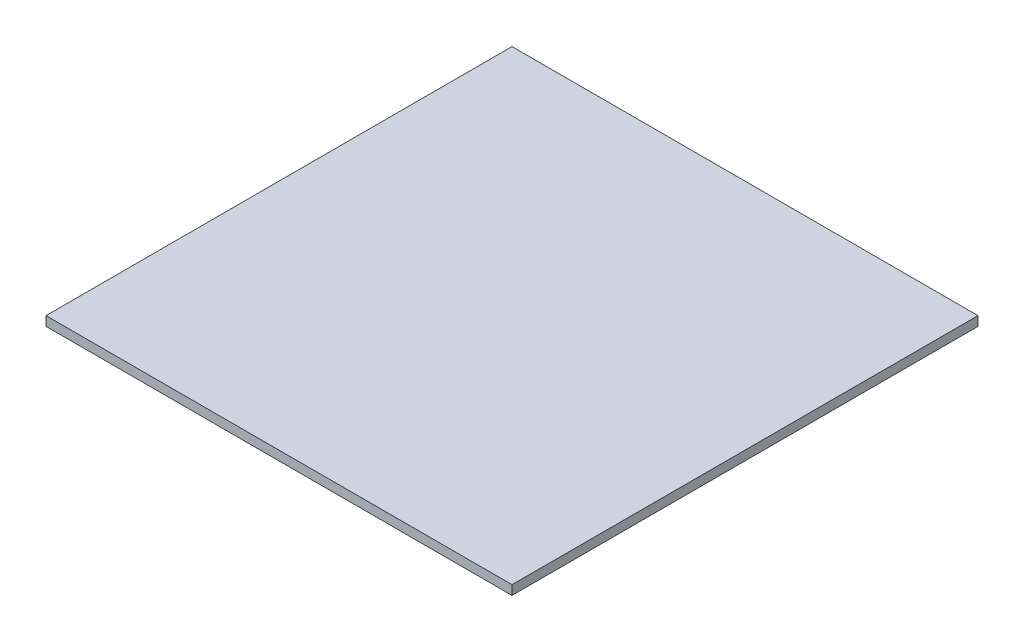
ISO-10303-21;
HEADER;
FILE_DESCRIPTION(('STEP AP214'),'2;1');
FILE_NAME('part.step','',(''),(''),'','','');
FILE_SCHEMA(('AUTOMOTIVE_DESIGN { 1 0 10303 214 1 1 1 1 }'));
ENDSEC;
DATA;
#1=APPLICATION_CONTEXT('core data for automotive mechanical design processes');
#2=APPLICATION_PROTOCOL_DEFINITION('international standard','automotive_design',2000,#1);
#3=PRODUCT_CONTEXT('',#1,'mechanical');
#4=PRODUCT('Part','Part','',(#3));
#5=PRODUCT_RELATED_PRODUCT_CATEGORY('part','',(#4));
#6=PRODUCT_DEFINITION_FORMATION('','',#4);
#7=PRODUCT_DEFINITION_CONTEXT('part definition',#1,'design');
#8=PRODUCT_DEFINITION('design','',#6,#7);
#9=PRODUCT_DEFINITION_SHAPE('','',#8);
#10=(LENGTH_UNIT() NAMED_UNIT(*) SI_UNIT(.MILLI.,.METRE.));
#11=(NAMED_UNIT(*) PLANE_ANGLE_UNIT() SI_UNIT($,.RADIAN.));
#12=(NAMED_UNIT(*) SI_UNIT($,.STERADIAN.) SOLID_ANGLE_UNIT());
#13=UNCERTAINTY_MEASURE_WITH_UNIT(LENGTH_MEASURE(1.E-05),#10,'distance_accuracy_value','');
#14=(GEOMETRIC_REPRESENTATION_CONTEXT(3) GLOBAL_UNCERTAINTY_ASSIGNED_CONTEXT((#13)) GLOBAL_UNIT_ASSIGNED_CONTEXT((#10,
#11,#12)) REPRESENTATION_CONTEXT('',''));
#15=CARTESIAN_POINT('',(0.,0.,0.));
#16=DIRECTION('',(0.,0.,1.));
#17=DIRECTION('',(1.,0.,0.));
#18=AXIS2_PLACEMENT_3D('',#15,#16,#17);
#19=CARTESIAN_POINT('',(-250.,10.,0.));
#20=DIRECTION('',(1.,0.,0.));
#21=DIRECTION('',(0.,0.,-1.));
#22=AXIS2_PLACEMENT_3D('',#19,#20,#21);
#23=PLANE('',#22);
#24=DIRECTION('',(0.,0.,1.));
#25=VECTOR('',#24,1.);
#26=CARTESIAN_POINT('',(-250.,0.,0.));
#27=LINE('',#26,#25);
#28=CARTESIAN_POINT('',(-250.,0.,0.));
#29=VERTEX_POINT('',#28);
#30=CARTESIAN_POINT('',(-250.,0.,500.));
#31=VERTEX_POINT('',#30);
#32=EDGE_CURVE('E96',#29,#31,#27,.T.);
#33=ORIENTED_EDGE('',*,*,#32,.T.);
#34=DIRECTION('',(0.,-1.,0.));
#35=VECTOR('',#34,1.);
#36=CARTESIAN_POINT('',(-250.,10.,500.));
#37=LINE('',#36,#35);
#38=CARTESIAN_POINT('',(-250.,10.,500.));
#39=VERTEX_POINT('',#38);
#40=EDGE_CURVE('E11',#39,#31,#37,.T.);
#41=ORIENTED_EDGE('',*,*,#40,.F.);
#42=DIRECTION('',(0.,0.,1.));
#43=VECTOR('',#42,1.);
#44=CARTESIAN_POINT('',(-250.,10.,0.));
#45=LINE('',#44,#43);
#46=CARTESIAN_POINT('',(-250.,10.,0.));
#47=VERTEX_POINT('',#46);
#48=EDGE_CURVE('E84',#47,#39,#45,.T.);
#49=ORIENTED_EDGE('',*,*,#48,.F.);
#50=DIRECTION('',(0.,-1.,0.));
#51=VECTOR('',#50,1.);
#52=CARTESIAN_POINT('',(-250.,10.,0.));
#53=LINE('',#52,#51);
#54=EDGE_CURVE('E92',#47,#29,#53,.T.);
#55=ORIENTED_EDGE('',*,*,#54,.T.);
#56=EDGE_LOOP('',(#33,#41,#49,#55));
#57=FACE_BOUND('',#56,.T.);
#58=ADVANCED_FACE('F33',(#57),#23,.F.);
#59=CARTESIAN_POINT('',(-250.,10.,500.));
#60=DIRECTION('',(0.,0.,-1.));
#61=DIRECTION('',(-1.,0.,0.));
#62=AXIS2_PLACEMENT_3D('',#59,#60,#61);
#63=PLANE('',#62);
#64=DIRECTION('',(1.,0.,0.));
#65=VECTOR('',#64,1.);
#66=CARTESIAN_POINT('',(-250.,0.,500.));
#67=LINE('',#66,#65);
#68=CARTESIAN_POINT('',(250.,0.,500.));
#69=VERTEX_POINT('',#68);
#70=EDGE_CURVE('E88',#31,#69,#67,.T.);
#71=ORIENTED_EDGE('',*,*,#70,.T.);
#72=DIRECTION('',(0.,-1.,0.));
#73=VECTOR('',#72,1.);
#74=CARTESIAN_POINT('',(250.,10.,500.));
#75=LINE('',#74,#73);
#76=CARTESIAN_POINT('',(250.,10.,500.));
#77=VERTEX_POINT('',#76);
#78=EDGE_CURVE('E41',#77,#69,#75,.T.);
#79=ORIENTED_EDGE('',*,*,#78,.F.);
#80=DIRECTION('',(1.,0.,0.));
#81=VECTOR('',#80,1.);
#82=CARTESIAN_POINT('',(-250.,10.,500.));
#83=LINE('',#82,#81);
#84=EDGE_CURVE('E79',#39,#77,#83,.T.);
#85=ORIENTED_EDGE('',*,*,#84,.F.);
#86=ORIENTED_EDGE('',*,*,#40,.T.);
#87=EDGE_LOOP('',(#71,#79,#85,#86));
#88=FACE_BOUND('',#87,.T.);
#89=ADVANCED_FACE('F87',(#88),#63,.F.);
#90=CARTESIAN_POINT('',(250.,10.,0.));
#91=DIRECTION('',(-1.,0.,0.));
#92=DIRECTION('',(0.,0.,1.));
#93=AXIS2_PLACEMENT_3D('',#90,#91,#92);
#94=PLANE('',#93);
#95=DIRECTION('',(0.,0.,-1.));
#96=VECTOR('',#95,1.);
#97=CARTESIAN_POINT('',(250.,0.,0.));
#98=LINE('',#97,#96);
#99=CARTESIAN_POINT('',(250.,0.,0.));
#100=VERTEX_POINT('',#99);
#101=EDGE_CURVE('E66',#69,#100,#98,.T.);
#102=ORIENTED_EDGE('',*,*,#101,.T.);
#103=DIRECTION('',(0.,-1.,0.));
#104=VECTOR('',#103,1.);
#105=CARTESIAN_POINT('',(250.,10.,0.));
#106=LINE('',#105,#104);
#107=CARTESIAN_POINT('',(250.,10.,0.));
#108=VERTEX_POINT('',#107);
#109=EDGE_CURVE('E89',#108,#100,#106,.T.);
#110=ORIENTED_EDGE('',*,*,#109,.F.);
#111=DIRECTION('',(0.,0.,-1.));
#112=VECTOR('',#111,1.);
#113=CARTESIAN_POINT('',(250.,10.,0.));
#114=LINE('',#113,#112);
#115=EDGE_CURVE('E82',#77,#108,#114,.T.);
#116=ORIENTED_EDGE('',*,*,#115,.F.);
#117=ORIENTED_EDGE('',*,*,#78,.T.);
#118=EDGE_LOOP('',(#102,#110,#116,#117));
#119=FACE_BOUND('',#118,.T.);
#120=ADVANCED_FACE('F90',(#119),#94,.F.);
#121=CARTESIAN_POINT('',(-250.,10.,0.));
#122=DIRECTION('',(0.,0.,1.));
#123=DIRECTION('',(1.,0.,0.));
#124=AXIS2_PLACEMENT_3D('',#121,#122,#123);
#125=PLANE('',#124);
#126=DIRECTION('',(-1.,0.,0.));
#127=VECTOR('',#126,1.);
#128=CARTESIAN_POINT('',(-250.,0.,0.));
#129=LINE('',#128,#127);
#130=EDGE_CURVE('E72',#100,#29,#129,.T.);
#131=ORIENTED_EDGE('',*,*,#130,.T.);
#132=ORIENTED_EDGE('',*,*,#54,.F.);
#133=DIRECTION('',(-1.,0.,0.));
#134=VECTOR('',#133,1.);
#135=CARTESIAN_POINT('',(-250.,10.,0.));
#136=LINE('',#135,#134);
#137=EDGE_CURVE('E49',#108,#47,#136,.T.);
#138=ORIENTED_EDGE('',*,*,#137,.F.);
#139=ORIENTED_EDGE('',*,*,#109,.T.);
#140=EDGE_LOOP('',(#131,#132,#138,#139));
#141=FACE_BOUND('',#140,.T.);
#142=ADVANCED_FACE('F103',(#141),#125,.F.);
#143=CARTESIAN_POINT('',(0.,10.,0.));
#144=DIRECTION('',(0.,1.,0.));
#145=DIRECTION('',(0.,0.,1.));
#146=AXIS2_PLACEMENT_3D('',#143,#144,#145);
#147=PLANE('',#146);
#148=ORIENTED_EDGE('',*,*,#48,.T.);
#149=ORIENTED_EDGE('',*,*,#84,.T.);
#150=ORIENTED_EDGE('',*,*,#115,.T.);
#151=ORIENTED_EDGE('',*,*,#137,.T.);
#152=EDGE_LOOP('',(#148,#149,#150,#151));
#153=FACE_BOUND('',#152,.T.);
#154=ADVANCED_FACE('F80',(#153),#147,.T.);
#155=CARTESIAN_POINT('',(0.,0.,0.));
#156=DIRECTION('',(0.,1.,0.));
#157=DIRECTION('',(0.,0.,1.));
#158=AXIS2_PLACEMENT_3D('',#155,#156,#157);
#159=PLANE('',#158);
#160=ORIENTED_EDGE('',*,*,#32,.F.);
#161=ORIENTED_EDGE('',*,*,#130,.F.);
#162=ORIENTED_EDGE('',*,*,#101,.F.);
#163=ORIENTED_EDGE('',*,*,#70,.F.);
#164=EDGE_LOOP('',(#160,#161,#162,#163));
#165=FACE_BOUND('',#164,.T.);
#166=ADVANCED_FACE('F106',(#165),#159,.F.);
#167=CLOSED_SHELL('',(#58,#89,#120,#142,#154,#166));
#168=MANIFOLD_SOLID_BREP('B2',#167);
#169=ADVANCED_BREP_SHAPE_REPRESENTATION('',(#18,#168),#14);
#170=SHAPE_DEFINITION_REPRESENTATION(#9,#169);
ENDSEC;
END-ISO-10303-21;
